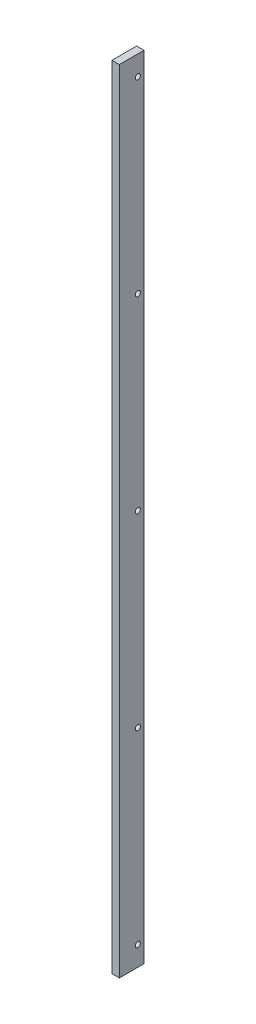
ISO-10303-21;
HEADER;
FILE_DESCRIPTION(('STEP AP214'),'2;1');
FILE_NAME('part.step','',(''),(''),'','','');
FILE_SCHEMA(('AUTOMOTIVE_DESIGN { 1 0 10303 214 1 1 1 1 }'));
ENDSEC;
DATA;
#1=APPLICATION_CONTEXT('core data for automotive mechanical design processes');
#2=APPLICATION_PROTOCOL_DEFINITION('international standard','automotive_design',2000,#1);
#3=PRODUCT_CONTEXT('',#1,'mechanical');
#4=PRODUCT('Part','Part','',(#3));
#5=PRODUCT_RELATED_PRODUCT_CATEGORY('part','',(#4));
#6=PRODUCT_DEFINITION_FORMATION('','',#4);
#7=PRODUCT_DEFINITION_CONTEXT('part definition',#1,'design');
#8=PRODUCT_DEFINITION('design','',#6,#7);
#9=PRODUCT_DEFINITION_SHAPE('','',#8);
#10=(LENGTH_UNIT() NAMED_UNIT(*) SI_UNIT(.MILLI.,.METRE.));
#11=(NAMED_UNIT(*) PLANE_ANGLE_UNIT() SI_UNIT($,.RADIAN.));
#12=(NAMED_UNIT(*) SI_UNIT($,.STERADIAN.) SOLID_ANGLE_UNIT());
#13=UNCERTAINTY_MEASURE_WITH_UNIT(LENGTH_MEASURE(1.E-05),#10,'distance_accuracy_value','');
#14=(GEOMETRIC_REPRESENTATION_CONTEXT(3) GLOBAL_UNCERTAINTY_ASSIGNED_CONTEXT((#13)) GLOBAL_UNIT_ASSIGNED_CONTEXT((#10,
#11,#12)) REPRESENTATION_CONTEXT('',''));
#15=CARTESIAN_POINT('',(0.,0.,0.));
#16=DIRECTION('',(0.,0.,1.));
#17=DIRECTION('',(1.,0.,0.));
#18=AXIS2_PLACEMENT_3D('',#15,#16,#17);
#19=CARTESIAN_POINT('',(0.,0.,0.));
#20=DIRECTION('',(1.,0.,0.));
#21=DIRECTION('',(0.,0.,-1.));
#22=AXIS2_PLACEMENT_3D('',#19,#20,#21);
#23=PLANE('',#22);
#24=CARTESIAN_POINT('',(0.,25.4,-7.9375));
#25=DIRECTION('',(-1.,0.,0.));
#26=DIRECTION('',(0.,0.,1.));
#27=AXIS2_PLACEMENT_3D('',#24,#25,#26);
#28=CIRCLE('',#27,7.25169999995205);
#29=CARTESIAN_POINT('',(0.,25.4,-0.685800000047948));
#30=VERTEX_POINT('',#29);
#31=EDGE_CURVE('E68',#30,#30,#28,.F.);
#32=ORIENTED_EDGE('',*,*,#31,.T.);
#33=EDGE_LOOP('',(#32));
#34=FACE_BOUND('',#33,.T.);
#35=CARTESIAN_POINT('',(0.,266.7,-7.9375));
#36=DIRECTION('',(-1.,0.,0.));
#37=DIRECTION('',(0.,0.,1.));
#38=AXIS2_PLACEMENT_3D('',#35,#36,#37);
#39=CIRCLE('',#38,7.25169999995205);
#40=CARTESIAN_POINT('',(0.,266.7,-0.685800000047948));
#41=VERTEX_POINT('',#40);
#42=EDGE_CURVE('E112',#41,#41,#39,.F.);
#43=ORIENTED_EDGE('',*,*,#42,.T.);
#44=EDGE_LOOP('',(#43));
#45=FACE_BOUND('',#44,.T.);
#46=CARTESIAN_POINT('',(0.,508.,-7.9375));
#47=DIRECTION('',(-1.,0.,0.));
#48=DIRECTION('',(0.,0.,1.));
#49=AXIS2_PLACEMENT_3D('',#46,#47,#48);
#50=CIRCLE('',#49,7.25169999995205);
#51=CARTESIAN_POINT('',(0.,508.,-0.685800000047948));
#52=VERTEX_POINT('',#51);
#53=EDGE_CURVE('E115',#52,#52,#50,.F.);
#54=ORIENTED_EDGE('',*,*,#53,.T.);
#55=EDGE_LOOP('',(#54));
#56=FACE_BOUND('',#55,.T.);
#57=CARTESIAN_POINT('',(0.,749.3,-7.9375));
#58=DIRECTION('',(-1.,0.,0.));
#59=DIRECTION('',(0.,0.,1.));
#60=AXIS2_PLACEMENT_3D('',#57,#58,#59);
#61=CIRCLE('',#60,7.25169999995205);
#62=CARTESIAN_POINT('',(0.,749.3,-0.685800000047948));
#63=VERTEX_POINT('',#62);
#64=EDGE_CURVE('E117',#63,#63,#61,.F.);
#65=ORIENTED_EDGE('',*,*,#64,.T.);
#66=EDGE_LOOP('',(#65));
#67=FACE_BOUND('',#66,.T.);
#68=CARTESIAN_POINT('',(0.,990.6,-7.9375));
#69=DIRECTION('',(-1.,0.,0.));
#70=DIRECTION('',(0.,0.,1.));
#71=AXIS2_PLACEMENT_3D('',#68,#69,#70);
#72=CIRCLE('',#71,7.25169999995205);
#73=CARTESIAN_POINT('',(0.,990.6,-0.685800000047948));
#74=VERTEX_POINT('',#73);
#75=EDGE_CURVE('E19',#74,#74,#72,.F.);
#76=ORIENTED_EDGE('',*,*,#75,.T.);
#77=EDGE_LOOP('',(#76));
#78=FACE_BOUND('',#77,.T.);
#79=DIRECTION('',(0.,0.,1.));
#80=VECTOR('',#79,1.);
#81=CARTESIAN_POINT('',(0.,1016.,-15.875));
#82=LINE('',#81,#80);
#83=CARTESIAN_POINT('',(0.,1016.,-15.875));
#84=VERTEX_POINT('',#83);
#85=CARTESIAN_POINT('',(0.,1016.,15.875));
#86=VERTEX_POINT('',#85);
#87=EDGE_CURVE('E54',#84,#86,#82,.T.);
#88=ORIENTED_EDGE('',*,*,#87,.F.);
#89=DIRECTION('',(0.,1.,0.));
#90=VECTOR('',#89,1.);
#91=CARTESIAN_POINT('',(0.,0.,-15.875));
#92=LINE('',#91,#90);
#93=CARTESIAN_POINT('',(0.,0.,-15.875));
#94=VERTEX_POINT('',#93);
#95=EDGE_CURVE('E59',#94,#84,#92,.T.);
#96=ORIENTED_EDGE('',*,*,#95,.F.);
#97=DIRECTION('',(0.,0.,-1.));
#98=VECTOR('',#97,1.);
#99=CARTESIAN_POINT('',(0.,0.,15.875));
#100=LINE('',#99,#98);
#101=CARTESIAN_POINT('',(0.,0.,15.875));
#102=VERTEX_POINT('',#101);
#103=EDGE_CURVE('E96',#102,#94,#100,.T.);
#104=ORIENTED_EDGE('',*,*,#103,.F.);
#105=DIRECTION('',(0.,1.,0.));
#106=VECTOR('',#105,1.);
#107=CARTESIAN_POINT('',(0.,1016.,15.875));
#108=LINE('',#107,#106);
#109=EDGE_CURVE('E70',#86,#102,#108,.F.);
#110=ORIENTED_EDGE('',*,*,#109,.F.);
#111=EDGE_LOOP('',(#88,#96,#104,#110));
#112=FACE_BOUND('',#111,.T.);
#113=ADVANCED_FACE('F16',(#34,#45,#56,#67,#78,#112),#23,.F.);
#114=CARTESIAN_POINT('',(0.,990.6,-7.9375));
#115=DIRECTION('',(-1.,0.,0.));
#116=DIRECTION('',(0.,0.,1.));
#117=AXIS2_PLACEMENT_3D('',#114,#115,#116);
#118=CONICAL_SURFACE('',#117,7.25169999995205,0.785398163397448);
#119=CARTESIAN_POINT('',(3.8862,990.6,-7.9375));
#120=DIRECTION('',(1.,0.,0.));
#121=DIRECTION('',(0.,0.,-1.));
#122=AXIS2_PLACEMENT_3D('',#119,#120,#121);
#123=CIRCLE('',#122,3.3655);
#124=CARTESIAN_POINT('',(3.8862,990.6,-11.303));
#125=VERTEX_POINT('',#124);
#126=EDGE_CURVE('E94',#125,#125,#123,.T.);
#127=ORIENTED_EDGE('',*,*,#126,.T.);
#128=EDGE_LOOP('',(#127));
#129=FACE_BOUND('',#128,.T.);
#130=ORIENTED_EDGE('',*,*,#75,.F.);
#131=EDGE_LOOP('',(#130));
#132=FACE_BOUND('',#131,.T.);
#133=ADVANCED_FACE('F125',(#129,#132),#118,.F.);
#134=CARTESIAN_POINT('',(5.6843418860808E-11,749.3,-7.9375));
#135=DIRECTION('',(-1.,0.,0.));
#136=DIRECTION('',(0.,0.,1.));
#137=AXIS2_PLACEMENT_3D('',#134,#135,#136);
#138=CONICAL_SURFACE('',#137,7.25169999989521,0.785398163390135);
#139=CARTESIAN_POINT('',(3.8862,749.3,-7.9375));
#140=DIRECTION('',(1.,0.,0.));
#141=DIRECTION('',(0.,0.,-1.));
#142=AXIS2_PLACEMENT_3D('',#139,#140,#141);
#143=CIRCLE('',#142,3.3655);
#144=CARTESIAN_POINT('',(3.8862,749.3,-11.303));
#145=VERTEX_POINT('',#144);
#146=EDGE_CURVE('E91',#145,#145,#143,.T.);
#147=ORIENTED_EDGE('',*,*,#146,.T.);
#148=EDGE_LOOP('',(#147));
#149=FACE_BOUND('',#148,.T.);
#150=ORIENTED_EDGE('',*,*,#64,.F.);
#151=EDGE_LOOP('',(#150));
#152=FACE_BOUND('',#151,.T.);
#153=ADVANCED_FACE('F127',(#149,#152),#138,.F.);
#154=CARTESIAN_POINT('',(5.6843418860808E-11,508.,-7.9375));
#155=DIRECTION('',(-1.,0.,0.));
#156=DIRECTION('',(0.,0.,1.));
#157=AXIS2_PLACEMENT_3D('',#154,#155,#156);
#158=CONICAL_SURFACE('',#157,7.25169999989521,0.785398163390135);
#159=CARTESIAN_POINT('',(3.8862,508.,-7.9375));
#160=DIRECTION('',(1.,0.,0.));
#161=DIRECTION('',(0.,0.,-1.));
#162=AXIS2_PLACEMENT_3D('',#159,#160,#161);
#163=CIRCLE('',#162,3.3655);
#164=CARTESIAN_POINT('',(3.8862,508.,-11.303));
#165=VERTEX_POINT('',#164);
#166=EDGE_CURVE('E88',#165,#165,#163,.T.);
#167=ORIENTED_EDGE('',*,*,#166,.T.);
#168=EDGE_LOOP('',(#167));
#169=FACE_BOUND('',#168,.T.);
#170=ORIENTED_EDGE('',*,*,#53,.F.);
#171=EDGE_LOOP('',(#170));
#172=FACE_BOUND('',#171,.T.);
#173=ADVANCED_FACE('F134',(#169,#172),#158,.F.);
#174=CARTESIAN_POINT('',(5.6843418860808E-11,266.7,-7.9375));
#175=DIRECTION('',(-1.,0.,0.));
#176=DIRECTION('',(0.,0.,1.));
#177=AXIS2_PLACEMENT_3D('',#174,#175,#176);
#178=CONICAL_SURFACE('',#177,7.25169999989521,0.785398163390135);
#179=CARTESIAN_POINT('',(3.8862,266.7,-7.9375));
#180=DIRECTION('',(1.,0.,0.));
#181=DIRECTION('',(0.,0.,-1.));
#182=AXIS2_PLACEMENT_3D('',#179,#180,#181);
#183=CIRCLE('',#182,3.3655);
#184=CARTESIAN_POINT('',(3.8862,266.7,-11.303));
#185=VERTEX_POINT('',#184);
#186=EDGE_CURVE('E85',#185,#185,#183,.T.);
#187=ORIENTED_EDGE('',*,*,#186,.T.);
#188=EDGE_LOOP('',(#187));
#189=FACE_BOUND('',#188,.T.);
#190=ORIENTED_EDGE('',*,*,#42,.F.);
#191=EDGE_LOOP('',(#190));
#192=FACE_BOUND('',#191,.T.);
#193=ADVANCED_FACE('F180',(#189,#192),#178,.F.);
#194=CARTESIAN_POINT('',(0.,25.4,-7.9375));
#195=DIRECTION('',(-1.,0.,0.));
#196=DIRECTION('',(0.,0.,1.));
#197=AXIS2_PLACEMENT_3D('',#194,#195,#196);
#198=CONICAL_SURFACE('',#197,7.25169999995205,0.785398163397448);
#199=CARTESIAN_POINT('',(3.8862,25.4,-7.9375));
#200=DIRECTION('',(1.,0.,0.));
#201=DIRECTION('',(0.,0.,-1.));
#202=AXIS2_PLACEMENT_3D('',#199,#200,#201);
#203=CIRCLE('',#202,3.3655);
#204=CARTESIAN_POINT('',(3.8862,25.4,-11.303));
#205=VERTEX_POINT('',#204);
#206=EDGE_CURVE('E81',#205,#205,#203,.T.);
#207=ORIENTED_EDGE('',*,*,#206,.T.);
#208=EDGE_LOOP('',(#207));
#209=FACE_BOUND('',#208,.T.);
#210=ORIENTED_EDGE('',*,*,#31,.F.);
#211=EDGE_LOOP('',(#210));
#212=FACE_BOUND('',#211,.T.);
#213=ADVANCED_FACE('F177',(#209,#212),#198,.F.);
#214=CARTESIAN_POINT('',(0.,0.,-15.875));
#215=DIRECTION('',(0.,0.,-1.));
#216=DIRECTION('',(-1.,0.,0.));
#217=AXIS2_PLACEMENT_3D('',#214,#215,#216);
#218=PLANE('',#217);
#219=DIRECTION('',(1.,0.,0.));
#220=VECTOR('',#219,1.);
#221=CARTESIAN_POINT('',(0.,0.,-15.875));
#222=LINE('',#221,#220);
#223=CARTESIAN_POINT('',(9.525,0.,-15.875));
#224=VERTEX_POINT('',#223);
#225=EDGE_CURVE('E64',#94,#224,#222,.T.);
#226=ORIENTED_EDGE('',*,*,#225,.F.);
#227=ORIENTED_EDGE('',*,*,#95,.T.);
#228=DIRECTION('',(1.,0.,0.));
#229=VECTOR('',#228,1.);
#230=CARTESIAN_POINT('',(0.,1016.,-15.875));
#231=LINE('',#230,#229);
#232=CARTESIAN_POINT('',(9.525,1016.,-15.875));
#233=VERTEX_POINT('',#232);
#234=EDGE_CURVE('E61',#233,#84,#231,.F.);
#235=ORIENTED_EDGE('',*,*,#234,.F.);
#236=DIRECTION('',(0.,1.,0.));
#237=VECTOR('',#236,1.);
#238=CARTESIAN_POINT('',(9.525,0.,-15.875));
#239=LINE('',#238,#237);
#240=EDGE_CURVE('E84',#224,#233,#239,.T.);
#241=ORIENTED_EDGE('',*,*,#240,.F.);
#242=EDGE_LOOP('',(#226,#227,#235,#241));
#243=FACE_BOUND('',#242,.T.);
#244=ADVANCED_FACE('F60',(#243),#218,.T.);
#245=CARTESIAN_POINT('',(0.,1016.,-15.875));
#246=DIRECTION('',(0.,1.,0.));
#247=DIRECTION('',(0.,0.,1.));
#248=AXIS2_PLACEMENT_3D('',#245,#246,#247);
#249=PLANE('',#248);
#250=ORIENTED_EDGE('',*,*,#234,.T.);
#251=ORIENTED_EDGE('',*,*,#87,.T.);
#252=DIRECTION('',(1.,0.,0.));
#253=VECTOR('',#252,1.);
#254=CARTESIAN_POINT('',(0.,1016.,15.875));
#255=LINE('',#254,#253);
#256=CARTESIAN_POINT('',(9.525,1016.,15.875));
#257=VERTEX_POINT('',#256);
#258=EDGE_CURVE('E72',#257,#86,#255,.F.);
#259=ORIENTED_EDGE('',*,*,#258,.F.);
#260=DIRECTION('',(0.,0.,-1.));
#261=VECTOR('',#260,1.);
#262=CARTESIAN_POINT('',(9.525,1016.,0.));
#263=LINE('',#262,#261);
#264=EDGE_CURVE('E76',#233,#257,#263,.F.);
#265=ORIENTED_EDGE('',*,*,#264,.F.);
#266=EDGE_LOOP('',(#250,#251,#259,#265));
#267=FACE_BOUND('',#266,.T.);
#268=ADVANCED_FACE('F74',(#267),#249,.T.);
#269=CARTESIAN_POINT('',(0.,1016.,15.875));
#270=DIRECTION('',(0.,0.,1.));
#271=DIRECTION('',(1.,0.,0.));
#272=AXIS2_PLACEMENT_3D('',#269,#270,#271);
#273=PLANE('',#272);
#274=ORIENTED_EDGE('',*,*,#258,.T.);
#275=ORIENTED_EDGE('',*,*,#109,.T.);
#276=DIRECTION('',(1.,0.,0.));
#277=VECTOR('',#276,1.);
#278=CARTESIAN_POINT('',(0.,0.,15.875));
#279=LINE('',#278,#277);
#280=CARTESIAN_POINT('',(9.525,0.,15.875));
#281=VERTEX_POINT('',#280);
#282=EDGE_CURVE('E34',#281,#102,#279,.F.);
#283=ORIENTED_EDGE('',*,*,#282,.F.);
#284=DIRECTION('',(0.,1.,0.));
#285=VECTOR('',#284,1.);
#286=CARTESIAN_POINT('',(9.525,0.,15.875));
#287=LINE('',#286,#285);
#288=EDGE_CURVE('E301',#257,#281,#287,.F.);
#289=ORIENTED_EDGE('',*,*,#288,.F.);
#290=EDGE_LOOP('',(#274,#275,#283,#289));
#291=FACE_BOUND('',#290,.T.);
#292=ADVANCED_FACE('F169',(#291),#273,.T.);
#293=CARTESIAN_POINT('',(0.,0.,15.875));
#294=DIRECTION('',(0.,-1.,0.));
#295=DIRECTION('',(0.,0.,-1.));
#296=AXIS2_PLACEMENT_3D('',#293,#294,#295);
#297=PLANE('',#296);
#298=ORIENTED_EDGE('',*,*,#282,.T.);
#299=ORIENTED_EDGE('',*,*,#103,.T.);
#300=ORIENTED_EDGE('',*,*,#225,.T.);
#301=DIRECTION('',(0.,0.,-1.));
#302=VECTOR('',#301,1.);
#303=CARTESIAN_POINT('',(9.525,0.,0.));
#304=LINE('',#303,#302);
#305=EDGE_CURVE('E109',#281,#224,#304,.T.);
#306=ORIENTED_EDGE('',*,*,#305,.F.);
#307=EDGE_LOOP('',(#298,#299,#300,#306));
#308=FACE_BOUND('',#307,.T.);
#309=ADVANCED_FACE('F165',(#308),#297,.T.);
#310=CARTESIAN_POINT('',(9.525,990.6,-7.9375));
#311=DIRECTION('',(1.,0.,0.));
#312=DIRECTION('',(0.,0.,-1.));
#313=AXIS2_PLACEMENT_3D('',#310,#311,#312);
#314=CYLINDRICAL_SURFACE('',#313,3.3655);
#315=CARTESIAN_POINT('',(9.525,990.6,-7.9375));
#316=DIRECTION('',(1.,0.,0.));
#317=DIRECTION('',(0.,0.,-1.));
#318=AXIS2_PLACEMENT_3D('',#315,#316,#317);
#319=CIRCLE('',#318,3.3655);
#320=CARTESIAN_POINT('',(9.525,990.6,-11.303));
#321=VERTEX_POINT('',#320);
#322=EDGE_CURVE('E106',#321,#321,#319,.F.);
#323=ORIENTED_EDGE('',*,*,#322,.F.);
#324=EDGE_LOOP('',(#323));
#325=FACE_BOUND('',#324,.T.);
#326=ORIENTED_EDGE('',*,*,#126,.F.);
#327=EDGE_LOOP('',(#326));
#328=FACE_BOUND('',#327,.T.);
#329=ADVANCED_FACE('F161',(#325,#328),#314,.F.);
#330=CARTESIAN_POINT('',(9.525,749.3,-7.9375));
#331=DIRECTION('',(1.,0.,0.));
#332=DIRECTION('',(0.,0.,-1.));
#333=AXIS2_PLACEMENT_3D('',#330,#331,#332);
#334=CYLINDRICAL_SURFACE('',#333,3.3655);
#335=CARTESIAN_POINT('',(9.525,749.3,-7.9375));
#336=DIRECTION('',(1.,0.,0.));
#337=DIRECTION('',(0.,0.,-1.));
#338=AXIS2_PLACEMENT_3D('',#335,#336,#337);
#339=CIRCLE('',#338,3.3655);
#340=CARTESIAN_POINT('',(9.525,749.3,-11.303));
#341=VERTEX_POINT('',#340);
#342=EDGE_CURVE('E103',#341,#341,#339,.F.);
#343=ORIENTED_EDGE('',*,*,#342,.F.);
#344=EDGE_LOOP('',(#343));
#345=FACE_BOUND('',#344,.T.);
#346=ORIENTED_EDGE('',*,*,#146,.F.);
#347=EDGE_LOOP('',(#346));
#348=FACE_BOUND('',#347,.T.);
#349=ADVANCED_FACE('F157',(#345,#348),#334,.F.);
#350=CARTESIAN_POINT('',(9.525,508.,-7.9375));
#351=DIRECTION('',(1.,0.,0.));
#352=DIRECTION('',(0.,0.,-1.));
#353=AXIS2_PLACEMENT_3D('',#350,#351,#352);
#354=CYLINDRICAL_SURFACE('',#353,3.3655);
#355=CARTESIAN_POINT('',(9.525,508.,-7.9375));
#356=DIRECTION('',(1.,0.,0.));
#357=DIRECTION('',(0.,0.,-1.));
#358=AXIS2_PLACEMENT_3D('',#355,#356,#357);
#359=CIRCLE('',#358,3.3655);
#360=CARTESIAN_POINT('',(9.525,508.,-11.303));
#361=VERTEX_POINT('',#360);
#362=EDGE_CURVE('E100',#361,#361,#359,.F.);
#363=ORIENTED_EDGE('',*,*,#362,.F.);
#364=EDGE_LOOP('',(#363));
#365=FACE_BOUND('',#364,.T.);
#366=ORIENTED_EDGE('',*,*,#166,.F.);
#367=EDGE_LOOP('',(#366));
#368=FACE_BOUND('',#367,.T.);
#369=ADVANCED_FACE('F153',(#365,#368),#354,.F.);
#370=CARTESIAN_POINT('',(9.525,266.7,-7.9375));
#371=DIRECTION('',(1.,0.,0.));
#372=DIRECTION('',(0.,0.,-1.));
#373=AXIS2_PLACEMENT_3D('',#370,#371,#372);
#374=CYLINDRICAL_SURFACE('',#373,3.3655);
#375=CARTESIAN_POINT('',(9.525,266.7,-7.9375));
#376=DIRECTION('',(1.,0.,0.));
#377=DIRECTION('',(0.,0.,-1.));
#378=AXIS2_PLACEMENT_3D('',#375,#376,#377);
#379=CIRCLE('',#378,3.3655);
#380=CARTESIAN_POINT('',(9.525,266.7,-11.303));
#381=VERTEX_POINT('',#380);
#382=EDGE_CURVE('E25',#381,#381,#379,.F.);
#383=ORIENTED_EDGE('',*,*,#382,.F.);
#384=EDGE_LOOP('',(#383));
#385=FACE_BOUND('',#384,.T.);
#386=ORIENTED_EDGE('',*,*,#186,.F.);
#387=EDGE_LOOP('',(#386));
#388=FACE_BOUND('',#387,.T.);
#389=ADVANCED_FACE('F146',(#385,#388),#374,.F.);
#390=CARTESIAN_POINT('',(9.525,25.4,-7.9375));
#391=DIRECTION('',(1.,0.,0.));
#392=DIRECTION('',(0.,0.,-1.));
#393=AXIS2_PLACEMENT_3D('',#390,#391,#392);
#394=CYLINDRICAL_SURFACE('',#393,3.3655);
#395=CARTESIAN_POINT('',(9.525,25.4,-7.9375));
#396=DIRECTION('',(1.,0.,0.));
#397=DIRECTION('',(0.,0.,-1.));
#398=AXIS2_PLACEMENT_3D('',#395,#396,#397);
#399=CIRCLE('',#398,3.3655);
#400=CARTESIAN_POINT('',(9.525,25.4,-11.303));
#401=VERTEX_POINT('',#400);
#402=EDGE_CURVE('E11',#401,#401,#399,.F.);
#403=ORIENTED_EDGE('',*,*,#402,.F.);
#404=EDGE_LOOP('',(#403));
#405=FACE_BOUND('',#404,.T.);
#406=ORIENTED_EDGE('',*,*,#206,.F.);
#407=EDGE_LOOP('',(#406));
#408=FACE_BOUND('',#407,.T.);
#409=ADVANCED_FACE('F140',(#405,#408),#394,.F.);
#410=CARTESIAN_POINT('',(9.525,0.,0.));
#411=DIRECTION('',(1.,0.,0.));
#412=DIRECTION('',(0.,0.,-1.));
#413=AXIS2_PLACEMENT_3D('',#410,#411,#412);
#414=PLANE('',#413);
#415=ORIENTED_EDGE('',*,*,#402,.T.);
#416=EDGE_LOOP('',(#415));
#417=FACE_BOUND('',#416,.T.);
#418=ORIENTED_EDGE('',*,*,#382,.T.);
#419=EDGE_LOOP('',(#418));
#420=FACE_BOUND('',#419,.T.);
#421=ORIENTED_EDGE('',*,*,#362,.T.);
#422=EDGE_LOOP('',(#421));
#423=FACE_BOUND('',#422,.T.);
#424=ORIENTED_EDGE('',*,*,#342,.T.);
#425=EDGE_LOOP('',(#424));
#426=FACE_BOUND('',#425,.T.);
#427=ORIENTED_EDGE('',*,*,#322,.T.);
#428=EDGE_LOOP('',(#427));
#429=FACE_BOUND('',#428,.T.);
#430=ORIENTED_EDGE('',*,*,#288,.T.);
#431=ORIENTED_EDGE('',*,*,#305,.T.);
#432=ORIENTED_EDGE('',*,*,#240,.T.);
#433=ORIENTED_EDGE('',*,*,#264,.T.);
#434=EDGE_LOOP('',(#430,#431,#432,#433));
#435=FACE_BOUND('',#434,.T.);
#436=ADVANCED_FACE('F138',(#417,#420,#423,#426,#429,#435),#414,.T.);
#437=CLOSED_SHELL('',(#113,#133,#153,#173,#193,#213,#244,#268,#292,#309,#329,#349,#369,#389,
#409,#436));
#438=MANIFOLD_SOLID_BREP('B1',#437);
#439=ADVANCED_BREP_SHAPE_REPRESENTATION('',(#18,#438),#14);
#440=SHAPE_DEFINITION_REPRESENTATION(#9,#439);
ENDSEC;
END-ISO-10303-21;
